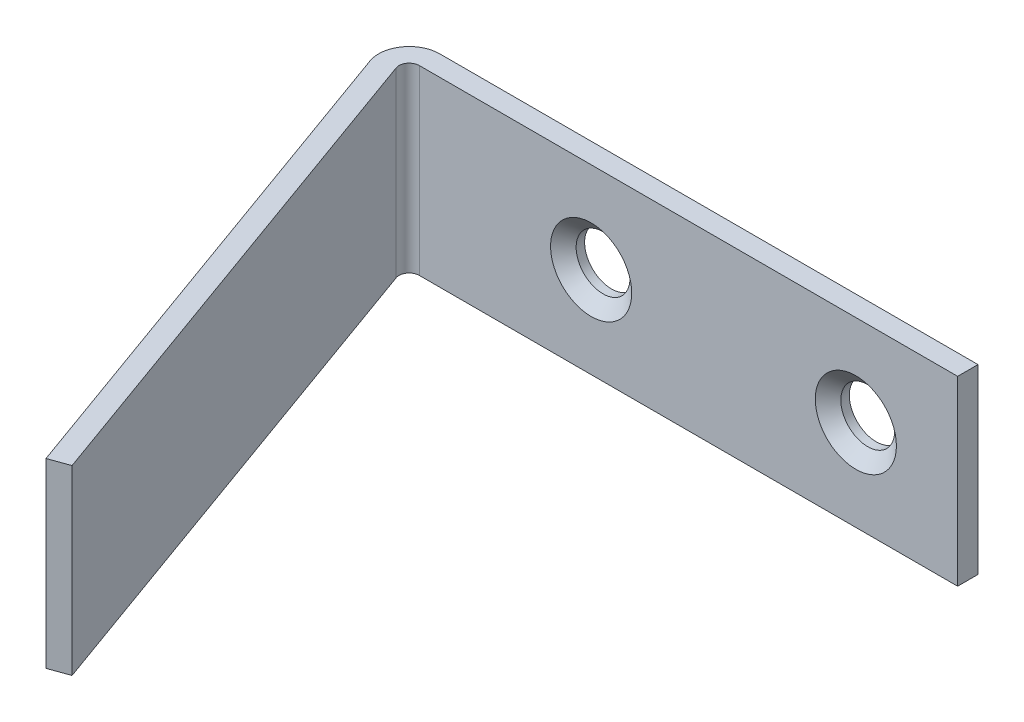
ISO-10303-21;
HEADER;
FILE_DESCRIPTION(('STEP AP214'),'2;1');
FILE_NAME('part.step','',(''),(''),'','','');
FILE_SCHEMA(('AUTOMOTIVE_DESIGN { 1 0 10303 214 1 1 1 1 }'));
ENDSEC;
DATA;
#1=APPLICATION_CONTEXT('core data for automotive mechanical design processes');
#2=APPLICATION_PROTOCOL_DEFINITION('international standard','automotive_design',2000,#1);
#3=PRODUCT_CONTEXT('',#1,'mechanical');
#4=PRODUCT('Part','Part','',(#3));
#5=PRODUCT_RELATED_PRODUCT_CATEGORY('part','',(#4));
#6=PRODUCT_DEFINITION_FORMATION('','',#4);
#7=PRODUCT_DEFINITION_CONTEXT('part definition',#1,'design');
#8=PRODUCT_DEFINITION('design','',#6,#7);
#9=PRODUCT_DEFINITION_SHAPE('','',#8);
#10=(LENGTH_UNIT() NAMED_UNIT(*) SI_UNIT(.MILLI.,.METRE.));
#11=(NAMED_UNIT(*) PLANE_ANGLE_UNIT() SI_UNIT($,.RADIAN.));
#12=(NAMED_UNIT(*) SI_UNIT($,.STERADIAN.) SOLID_ANGLE_UNIT());
#13=UNCERTAINTY_MEASURE_WITH_UNIT(LENGTH_MEASURE(1.E-05),#10,'distance_accuracy_value','');
#14=(GEOMETRIC_REPRESENTATION_CONTEXT(3) GLOBAL_UNCERTAINTY_ASSIGNED_CONTEXT((#13)) GLOBAL_UNIT_ASSIGNED_CONTEXT((#10,
#11,#12)) REPRESENTATION_CONTEXT('',''));
#15=CARTESIAN_POINT('',(0.,0.,0.));
#16=DIRECTION('',(0.,0.,1.));
#17=DIRECTION('',(1.,0.,0.));
#18=AXIS2_PLACEMENT_3D('',#15,#16,#17);
#19=CARTESIAN_POINT('',(3.79480894040002,7.9375,1.778));
#20=DIRECTION('',(0.,0.,-1.));
#21=DIRECTION('',(-1.,0.,0.));
#22=AXIS2_PLACEMENT_3D('',#19,#20,#21);
#23=PLANE('',#22);
#24=CARTESIAN_POINT('',(18.796,0.,1.778));
#25=DIRECTION('',(0.,0.,1.));
#26=DIRECTION('',(1.,0.,0.));
#27=AXIS2_PLACEMENT_3D('',#24,#25,#26);
#28=CIRCLE('',#27,3.5433);
#29=CARTESIAN_POINT('',(22.3393,0.,1.778));
#30=VERTEX_POINT('',#29);
#31=EDGE_CURVE('E173',#30,#30,#28,.T.);
#32=ORIENTED_EDGE('',*,*,#31,.F.);
#33=EDGE_LOOP('',(#32));
#34=FACE_BOUND('',#33,.T.);
#35=CARTESIAN_POINT('',(41.91,0.,1.778));
#36=DIRECTION('',(0.,0.,1.));
#37=DIRECTION('',(1.,0.,0.));
#38=AXIS2_PLACEMENT_3D('',#35,#36,#37);
#39=CIRCLE('',#38,3.5433);
#40=CARTESIAN_POINT('',(45.4533,0.,1.778));
#41=VERTEX_POINT('',#40);
#42=EDGE_CURVE('E163',#41,#41,#39,.T.);
#43=ORIENTED_EDGE('',*,*,#42,.F.);
#44=EDGE_LOOP('',(#43));
#45=FACE_BOUND('',#44,.T.);
#46=DIRECTION('',(1.,0.,0.));
#47=VECTOR('',#46,1.);
#48=CARTESIAN_POINT('',(3.79480894040002,-7.9375,1.778));
#49=LINE('',#48,#47);
#50=CARTESIAN_POINT('',(3.79480894040002,-7.9375,1.778));
#51=VERTEX_POINT('',#50);
#52=CARTESIAN_POINT('',(50.8,-7.9375,1.778));
#53=VERTEX_POINT('',#52);
#54=EDGE_CURVE('E134',#51,#53,#49,.T.);
#55=ORIENTED_EDGE('',*,*,#54,.T.);
#56=DIRECTION('',(0.,-1.,0.));
#57=VECTOR('',#56,1.);
#58=CARTESIAN_POINT('',(50.8,7.9375,1.778));
#59=LINE('',#58,#57);
#60=CARTESIAN_POINT('',(50.8,7.9375,1.778));
#61=VERTEX_POINT('',#60);
#62=EDGE_CURVE('E11',#61,#53,#59,.T.);
#63=ORIENTED_EDGE('',*,*,#62,.F.);
#64=DIRECTION('',(1.,0.,0.));
#65=VECTOR('',#64,1.);
#66=CARTESIAN_POINT('',(3.79480894040002,7.9375,1.778));
#67=LINE('',#66,#65);
#68=CARTESIAN_POINT('',(3.79480894040002,7.9375,1.778));
#69=VERTEX_POINT('',#68);
#70=EDGE_CURVE('E92',#69,#61,#67,.T.);
#71=ORIENTED_EDGE('',*,*,#70,.F.);
#72=DIRECTION('',(0.,-1.,0.));
#73=VECTOR('',#72,1.);
#74=CARTESIAN_POINT('',(3.79480894040002,7.9375,1.778));
#75=LINE('',#74,#73);
#76=EDGE_CURVE('E133',#69,#51,#75,.T.);
#77=ORIENTED_EDGE('',*,*,#76,.T.);
#78=EDGE_LOOP('',(#55,#63,#71,#77));
#79=FACE_BOUND('',#78,.T.);
#80=ADVANCED_FACE('F35',(#34,#45,#79),#23,.F.);
#81=CARTESIAN_POINT('',(50.8,7.9375,0.));
#82=DIRECTION('',(1.,0.,0.));
#83=DIRECTION('',(0.,0.,-1.));
#84=AXIS2_PLACEMENT_3D('',#81,#82,#83);
#85=PLANE('',#84);
#86=DIRECTION('',(0.,0.,1.));
#87=VECTOR('',#86,1.);
#88=CARTESIAN_POINT('',(50.8,-7.9375,0.));
#89=LINE('',#88,#87);
#90=CARTESIAN_POINT('',(50.8,-7.9375,0.));
#91=VERTEX_POINT('',#90);
#92=EDGE_CURVE('E137',#91,#53,#89,.T.);
#93=ORIENTED_EDGE('',*,*,#92,.F.);
#94=DIRECTION('',(0.,-1.,0.));
#95=VECTOR('',#94,1.);
#96=CARTESIAN_POINT('',(50.8,7.9375,0.));
#97=LINE('',#96,#95);
#98=CARTESIAN_POINT('',(50.8,7.9375,0.));
#99=VERTEX_POINT('',#98);
#100=EDGE_CURVE('E44',#99,#91,#97,.T.);
#101=ORIENTED_EDGE('',*,*,#100,.F.);
#102=DIRECTION('',(0.,0.,1.));
#103=VECTOR('',#102,1.);
#104=CARTESIAN_POINT('',(50.8,7.9375,0.));
#105=LINE('',#104,#103);
#106=EDGE_CURVE('E179',#99,#61,#105,.T.);
#107=ORIENTED_EDGE('',*,*,#106,.T.);
#108=ORIENTED_EDGE('',*,*,#62,.T.);
#109=EDGE_LOOP('',(#93,#101,#107,#108));
#110=FACE_BOUND('',#109,.T.);
#111=ADVANCED_FACE('F209',(#110),#85,.T.);
#112=CARTESIAN_POINT('',(3.79480894040002,7.9375,0.));
#113=DIRECTION('',(0.,0.,-1.));
#114=DIRECTION('',(-1.,0.,0.));
#115=AXIS2_PLACEMENT_3D('',#112,#113,#114);
#116=PLANE('',#115);
#117=CARTESIAN_POINT('',(18.796,0.,0.));
#118=DIRECTION('',(0.,0.,1.));
#119=DIRECTION('',(1.,0.,0.));
#120=AXIS2_PLACEMENT_3D('',#117,#118,#119);
#121=CIRCLE('',#120,2.3495);
#122=CARTESIAN_POINT('',(21.1455,0.,0.));
#123=VERTEX_POINT('',#122);
#124=EDGE_CURVE('E162',#123,#123,#121,.T.);
#125=ORIENTED_EDGE('',*,*,#124,.T.);
#126=EDGE_LOOP('',(#125));
#127=FACE_BOUND('',#126,.T.);
#128=CARTESIAN_POINT('',(41.91,0.,0.));
#129=DIRECTION('',(0.,0.,1.));
#130=DIRECTION('',(1.,0.,0.));
#131=AXIS2_PLACEMENT_3D('',#128,#129,#130);
#132=CIRCLE('',#131,2.34949999999999);
#133=CARTESIAN_POINT('',(44.2595,0.,0.));
#134=VERTEX_POINT('',#133);
#135=EDGE_CURVE('E138',#134,#134,#132,.T.);
#136=ORIENTED_EDGE('',*,*,#135,.T.);
#137=EDGE_LOOP('',(#136));
#138=FACE_BOUND('',#137,.T.);
#139=DIRECTION('',(1.,0.,0.));
#140=VECTOR('',#139,1.);
#141=CARTESIAN_POINT('',(3.79480894040002,-7.9375,0.));
#142=LINE('',#141,#140);
#143=CARTESIAN_POINT('',(3.79480894040002,-7.9375,0.));
#144=VERTEX_POINT('',#143);
#145=EDGE_CURVE('E141',#144,#91,#142,.T.);
#146=ORIENTED_EDGE('',*,*,#145,.F.);
#147=DIRECTION('',(0.,-1.,0.));
#148=VECTOR('',#147,1.);
#149=CARTESIAN_POINT('',(3.79480894040002,7.9375,0.));
#150=LINE('',#149,#148);
#151=CARTESIAN_POINT('',(3.79480894040002,7.9375,0.));
#152=VERTEX_POINT('',#151);
#153=EDGE_CURVE('E158',#152,#144,#150,.T.);
#154=ORIENTED_EDGE('',*,*,#153,.F.);
#155=DIRECTION('',(1.,0.,0.));
#156=VECTOR('',#155,1.);
#157=CARTESIAN_POINT('',(3.79480894040002,7.9375,0.));
#158=LINE('',#157,#156);
#159=EDGE_CURVE('E182',#152,#99,#158,.T.);
#160=ORIENTED_EDGE('',*,*,#159,.T.);
#161=ORIENTED_EDGE('',*,*,#100,.T.);
#162=EDGE_LOOP('',(#146,#154,#160,#161));
#163=FACE_BOUND('',#162,.T.);
#164=ADVANCED_FACE('F214',(#127,#138,#163),#116,.T.);
#165=CARTESIAN_POINT('',(3.79480894040002,7.9375,2.667));
#166=DIRECTION('',(0.,-1.,0.));
#167=DIRECTION('',(0.,0.,-1.));
#168=AXIS2_PLACEMENT_3D('',#165,#166,#167);
#169=CYLINDRICAL_SURFACE('',#168,2.667);
#170=CARTESIAN_POINT('',(3.79480894040002,-7.9375,2.667));
#171=DIRECTION('',(0.,-1.,0.));
#172=DIRECTION('',(0.,0.,1.));
#173=AXIS2_PLACEMENT_3D('',#170,#171,#172);
#174=CIRCLE('',#173,2.667);
#175=CARTESIAN_POINT('',(1.28549152856051,-7.9375,3.57044625));
#176=VERTEX_POINT('',#175);
#177=EDGE_CURVE('E144',#176,#144,#174,.T.);
#178=ORIENTED_EDGE('',*,*,#177,.F.);
#179=DIRECTION('',(0.,-1.,0.));
#180=VECTOR('',#179,1.);
#181=CARTESIAN_POINT('',(1.28549152856051,7.9375,3.57044625));
#182=LINE('',#181,#180);
#183=CARTESIAN_POINT('',(1.28549152856051,7.9375,3.57044625));
#184=VERTEX_POINT('',#183);
#185=EDGE_CURVE('E156',#184,#176,#182,.T.);
#186=ORIENTED_EDGE('',*,*,#185,.F.);
#187=CARTESIAN_POINT('',(3.79480894040002,7.9375,2.667));
#188=DIRECTION('',(0.,-1.,0.));
#189=DIRECTION('',(0.,0.,1.));
#190=AXIS2_PLACEMENT_3D('',#187,#188,#189);
#191=CIRCLE('',#190,2.667);
#192=EDGE_CURVE('E128',#184,#152,#191,.T.);
#193=ORIENTED_EDGE('',*,*,#192,.T.);
#194=ORIENTED_EDGE('',*,*,#153,.T.);
#195=EDGE_LOOP('',(#178,#186,#193,#194));
#196=FACE_BOUND('',#195,.T.);
#197=ADVANCED_FACE('F187',(#196),#169,.T.);
#198=CARTESIAN_POINT('',(17.2085,7.9375,47.7965221302764));
#199=DIRECTION('',(-0.94087641988733,0.,0.33875));
#200=DIRECTION('',(0.33875,0.,0.94087641988733));
#201=AXIS2_PLACEMENT_3D('',#198,#199,#200);
#202=PLANE('',#201);
#203=DIRECTION('',(-0.33875,0.,-0.94087641988733));
#204=VECTOR('',#203,1.);
#205=CARTESIAN_POINT('',(17.2085,-7.9375,47.7965221302764));
#206=LINE('',#205,#204);
#207=CARTESIAN_POINT('',(17.2085,-7.9375,47.7965221302764));
#208=VERTEX_POINT('',#207);
#209=EDGE_CURVE('E147',#208,#176,#206,.T.);
#210=ORIENTED_EDGE('',*,*,#209,.F.);
#211=DIRECTION('',(0.,-1.,0.));
#212=VECTOR('',#211,1.);
#213=CARTESIAN_POINT('',(17.2085,7.9375,47.7965221302764));
#214=LINE('',#213,#212);
#215=CARTESIAN_POINT('',(17.2085,7.9375,47.7965221302764));
#216=VERTEX_POINT('',#215);
#217=EDGE_CURVE('E116',#216,#208,#214,.T.);
#218=ORIENTED_EDGE('',*,*,#217,.F.);
#219=DIRECTION('',(-0.33875,0.,-0.94087641988733));
#220=VECTOR('',#219,1.);
#221=CARTESIAN_POINT('',(17.2085,7.9375,47.7965221302764));
#222=LINE('',#221,#220);
#223=EDGE_CURVE('E126',#216,#184,#222,.T.);
#224=ORIENTED_EDGE('',*,*,#223,.T.);
#225=ORIENTED_EDGE('',*,*,#185,.T.);
#226=EDGE_LOOP('',(#210,#218,#224,#225));
#227=FACE_BOUND('',#226,.T.);
#228=ADVANCED_FACE('F192',(#227),#202,.T.);
#229=CARTESIAN_POINT('',(18.8813782745597,7.9375,47.1942246302764));
#230=DIRECTION('',(0.338750000000001,0.,0.94087641988733));
#231=DIRECTION('',(0.94087641988733,0.,-0.338750000000001));
#232=AXIS2_PLACEMENT_3D('',#229,#230,#231);
#233=PLANE('',#232);
#234=DIRECTION('',(-0.94087641988733,0.,0.338750000000001));
#235=VECTOR('',#234,1.);
#236=CARTESIAN_POINT('',(18.8813782745597,-7.9375,47.1942246302764));
#237=LINE('',#236,#235);
#238=CARTESIAN_POINT('',(18.8813782745597,-7.9375,47.1942246302764));
#239=VERTEX_POINT('',#238);
#240=EDGE_CURVE('E115',#239,#208,#237,.T.);
#241=ORIENTED_EDGE('',*,*,#240,.F.);
#242=DIRECTION('',(0.,-1.,0.));
#243=VECTOR('',#242,1.);
#244=CARTESIAN_POINT('',(18.8813782745597,7.9375,47.1942246302764));
#245=LINE('',#244,#243);
#246=CARTESIAN_POINT('',(18.8813782745597,7.9375,47.1942246302764));
#247=VERTEX_POINT('',#246);
#248=EDGE_CURVE('E109',#247,#239,#245,.T.);
#249=ORIENTED_EDGE('',*,*,#248,.F.);
#250=DIRECTION('',(-0.94087641988733,0.,0.338750000000001));
#251=VECTOR('',#250,1.);
#252=CARTESIAN_POINT('',(18.8813782745597,7.9375,47.1942246302764));
#253=LINE('',#252,#251);
#254=EDGE_CURVE('E113',#247,#216,#253,.T.);
#255=ORIENTED_EDGE('',*,*,#254,.T.);
#256=ORIENTED_EDGE('',*,*,#217,.T.);
#257=EDGE_LOOP('',(#241,#249,#255,#256));
#258=FACE_BOUND('',#257,.T.);
#259=ADVANCED_FACE('F111',(#258),#233,.T.);
#260=CARTESIAN_POINT('',(18.8813782745597,7.9375,47.1942246302764));
#261=DIRECTION('',(-0.94087641988733,0.,0.33875));
#262=DIRECTION('',(0.33875,0.,0.94087641988733));
#263=AXIS2_PLACEMENT_3D('',#260,#261,#262);
#264=PLANE('',#263);
#265=DIRECTION('',(-0.33875,0.,-0.940876419887331));
#266=VECTOR('',#265,1.);
#267=CARTESIAN_POINT('',(18.8813782745597,-7.9375,47.1942246302764));
#268=LINE('',#267,#266);
#269=CARTESIAN_POINT('',(2.95836980312018,-7.9375,2.96814875));
#270=VERTEX_POINT('',#269);
#271=EDGE_CURVE('E80',#239,#270,#268,.T.);
#272=ORIENTED_EDGE('',*,*,#271,.T.);
#273=DIRECTION('',(0.,-1.,0.));
#274=VECTOR('',#273,1.);
#275=CARTESIAN_POINT('',(2.95836980312018,7.9375,2.96814875));
#276=LINE('',#275,#274);
#277=CARTESIAN_POINT('',(2.95836980312018,7.9375,2.96814875));
#278=VERTEX_POINT('',#277);
#279=EDGE_CURVE('E117',#278,#270,#276,.T.);
#280=ORIENTED_EDGE('',*,*,#279,.F.);
#281=DIRECTION('',(-0.33875,0.,-0.940876419887331));
#282=VECTOR('',#281,1.);
#283=CARTESIAN_POINT('',(18.8813782745597,7.9375,47.1942246302764));
#284=LINE('',#283,#282);
#285=EDGE_CURVE('E119',#247,#278,#284,.T.);
#286=ORIENTED_EDGE('',*,*,#285,.F.);
#287=ORIENTED_EDGE('',*,*,#248,.T.);
#288=EDGE_LOOP('',(#272,#280,#286,#287));
#289=FACE_BOUND('',#288,.T.);
#290=ADVANCED_FACE('F120',(#289),#264,.F.);
#291=CARTESIAN_POINT('',(3.79480894040002,7.9375,2.667));
#292=DIRECTION('',(0.,-1.,0.));
#293=DIRECTION('',(0.,0.,-1.));
#294=AXIS2_PLACEMENT_3D('',#291,#292,#293);
#295=CYLINDRICAL_SURFACE('',#294,0.889000000000003);
#296=CARTESIAN_POINT('',(3.79480894040002,-7.9375,2.667));
#297=DIRECTION('',(0.,1.,0.));
#298=DIRECTION('',(1.,0.,0.));
#299=AXIS2_PLACEMENT_3D('',#296,#297,#298);
#300=CIRCLE('',#299,0.889000000000003);
#301=EDGE_CURVE('E86',#270,#51,#300,.F.);
#302=ORIENTED_EDGE('',*,*,#301,.T.);
#303=ORIENTED_EDGE('',*,*,#76,.F.);
#304=CARTESIAN_POINT('',(3.79480894040002,7.9375,2.667));
#305=DIRECTION('',(0.,1.,0.));
#306=DIRECTION('',(1.,0.,0.));
#307=AXIS2_PLACEMENT_3D('',#304,#305,#306);
#308=CIRCLE('',#307,0.889000000000003);
#309=EDGE_CURVE('E53',#278,#69,#308,.F.);
#310=ORIENTED_EDGE('',*,*,#309,.F.);
#311=ORIENTED_EDGE('',*,*,#279,.T.);
#312=EDGE_LOOP('',(#302,#303,#310,#311));
#313=FACE_BOUND('',#312,.T.);
#314=ADVANCED_FACE('F198',(#313),#295,.F.);
#315=CARTESIAN_POINT('',(3.79480894040002,7.9375,2.667));
#316=DIRECTION('',(0.,-1.,0.));
#317=DIRECTION('',(-1.,0.,0.));
#318=AXIS2_PLACEMENT_3D('',#315,#316,#317);
#319=PLANE('',#318);
#320=ORIENTED_EDGE('',*,*,#70,.T.);
#321=ORIENTED_EDGE('',*,*,#106,.F.);
#322=ORIENTED_EDGE('',*,*,#159,.F.);
#323=ORIENTED_EDGE('',*,*,#192,.F.);
#324=ORIENTED_EDGE('',*,*,#223,.F.);
#325=ORIENTED_EDGE('',*,*,#254,.F.);
#326=ORIENTED_EDGE('',*,*,#285,.T.);
#327=ORIENTED_EDGE('',*,*,#309,.T.);
#328=EDGE_LOOP('',(#320,#321,#322,#323,#324,#325,#326,#327));
#329=FACE_BOUND('',#328,.T.);
#330=ADVANCED_FACE('F123',(#329),#319,.F.);
#331=CARTESIAN_POINT('',(3.79480894040002,-7.9375,2.667));
#332=DIRECTION('',(0.,-1.,0.));
#333=DIRECTION('',(-1.,0.,0.));
#334=AXIS2_PLACEMENT_3D('',#331,#332,#333);
#335=PLANE('',#334);
#336=ORIENTED_EDGE('',*,*,#54,.F.);
#337=ORIENTED_EDGE('',*,*,#301,.F.);
#338=ORIENTED_EDGE('',*,*,#271,.F.);
#339=ORIENTED_EDGE('',*,*,#240,.T.);
#340=ORIENTED_EDGE('',*,*,#209,.T.);
#341=ORIENTED_EDGE('',*,*,#177,.T.);
#342=ORIENTED_EDGE('',*,*,#145,.T.);
#343=ORIENTED_EDGE('',*,*,#92,.T.);
#344=EDGE_LOOP('',(#336,#337,#338,#339,#340,#341,#342,#343));
#345=FACE_BOUND('',#344,.T.);
#346=ADVANCED_FACE('F195',(#345),#335,.T.);
#347=CARTESIAN_POINT('',(41.91,0.,0.));
#348=DIRECTION('',(0.,0.,1.));
#349=DIRECTION('',(1.,0.,0.));
#350=AXIS2_PLACEMENT_3D('',#347,#348,#349);
#351=CYLINDRICAL_SURFACE('',#350,2.34949999999999);
#352=CARTESIAN_POINT('',(41.91,0.,0.740245492394984));
#353=DIRECTION('',(0.,0.,1.));
#354=DIRECTION('',(1.,0.,0.));
#355=AXIS2_PLACEMENT_3D('',#352,#353,#354);
#356=CIRCLE('',#355,2.34949999999999);
#357=CARTESIAN_POINT('',(44.2595,0.,0.740245492394984));
#358=VERTEX_POINT('',#357);
#359=EDGE_CURVE('E160',#358,#358,#356,.T.);
#360=ORIENTED_EDGE('',*,*,#359,.T.);
#361=EDGE_LOOP('',(#360));
#362=FACE_BOUND('',#361,.T.);
#363=ORIENTED_EDGE('',*,*,#135,.F.);
#364=EDGE_LOOP('',(#363));
#365=FACE_BOUND('',#364,.T.);
#366=ADVANCED_FACE('F230',(#362,#365),#351,.F.);
#367=CARTESIAN_POINT('',(18.796,0.,0.));
#368=DIRECTION('',(0.,0.,1.));
#369=DIRECTION('',(1.,0.,0.));
#370=AXIS2_PLACEMENT_3D('',#367,#368,#369);
#371=CYLINDRICAL_SURFACE('',#370,2.3495);
#372=CARTESIAN_POINT('',(18.796,0.,0.740245492394996));
#373=DIRECTION('',(0.,0.,1.));
#374=DIRECTION('',(1.,0.,0.));
#375=AXIS2_PLACEMENT_3D('',#372,#373,#374);
#376=CIRCLE('',#375,2.3495);
#377=CARTESIAN_POINT('',(21.1455,0.,0.740245492394996));
#378=VERTEX_POINT('',#377);
#379=EDGE_CURVE('E38',#378,#378,#376,.T.);
#380=ORIENTED_EDGE('',*,*,#379,.T.);
#381=EDGE_LOOP('',(#380));
#382=FACE_BOUND('',#381,.T.);
#383=ORIENTED_EDGE('',*,*,#124,.F.);
#384=EDGE_LOOP('',(#383));
#385=FACE_BOUND('',#384,.T.);
#386=ADVANCED_FACE('F227',(#382,#385),#371,.F.);
#387=CARTESIAN_POINT('',(41.91,0.,1.778));
#388=DIRECTION('',(0.,0.,1.));
#389=DIRECTION('',(1.,0.,0.));
#390=AXIS2_PLACEMENT_3D('',#387,#388,#389);
#391=CONICAL_SURFACE('',#390,3.5433,0.855211333477223);
#392=ORIENTED_EDGE('',*,*,#42,.T.);
#393=EDGE_LOOP('',(#392));
#394=FACE_BOUND('',#393,.T.);
#395=ORIENTED_EDGE('',*,*,#359,.F.);
#396=EDGE_LOOP('',(#395));
#397=FACE_BOUND('',#396,.T.);
#398=ADVANCED_FACE('F223',(#394,#397),#391,.F.);
#399=CARTESIAN_POINT('',(18.796,0.,1.778));
#400=DIRECTION('',(0.,0.,1.));
#401=DIRECTION('',(1.,0.,0.));
#402=AXIS2_PLACEMENT_3D('',#399,#400,#401);
#403=CONICAL_SURFACE('',#402,3.5433,0.855211333477223);
#404=ORIENTED_EDGE('',*,*,#31,.T.);
#405=EDGE_LOOP('',(#404));
#406=FACE_BOUND('',#405,.T.);
#407=ORIENTED_EDGE('',*,*,#379,.F.);
#408=EDGE_LOOP('',(#407));
#409=FACE_BOUND('',#408,.T.);
#410=ADVANCED_FACE('F220',(#406,#409),#403,.F.);
#411=CLOSED_SHELL('',(#80,#111,#164,#197,#228,#259,#290,#314,#330,#346,#366,#386,#398,#410));
#412=MANIFOLD_SOLID_BREP('B2',#411);
#413=ADVANCED_BREP_SHAPE_REPRESENTATION('',(#18,#412),#14);
#414=SHAPE_DEFINITION_REPRESENTATION(#9,#413);
ENDSEC;
END-ISO-10303-21;
